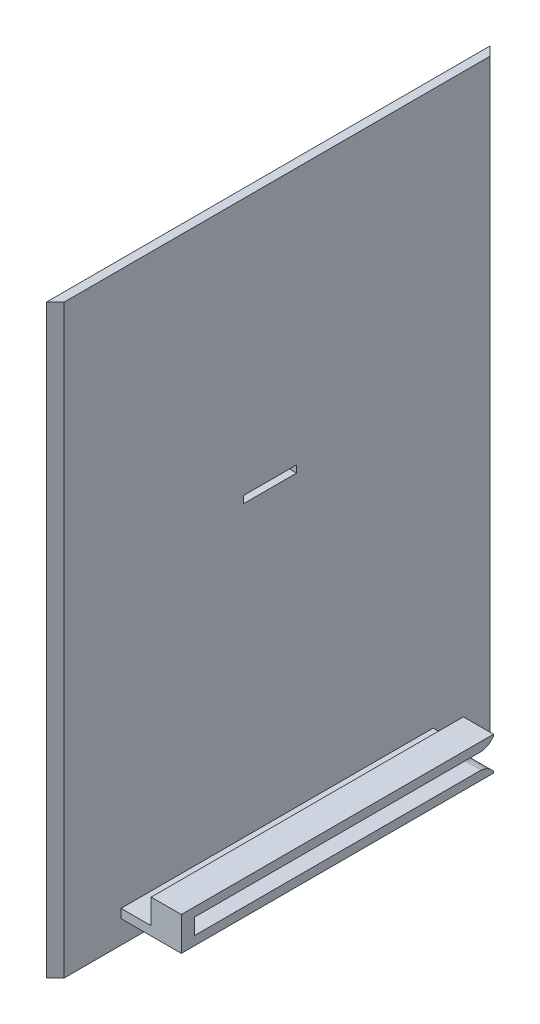
ISO-10303-21;
HEADER;
FILE_DESCRIPTION(('STEP AP214'),'2;1');
FILE_NAME('part.step','',(''),(''),'','','');
FILE_SCHEMA(('AUTOMOTIVE_DESIGN { 1 0 10303 214 1 1 1 1 }'));
ENDSEC;
DATA;
#1=APPLICATION_CONTEXT('core data for automotive mechanical design processes');
#2=APPLICATION_PROTOCOL_DEFINITION('international standard','automotive_design',2000,#1);
#3=PRODUCT_CONTEXT('',#1,'mechanical');
#4=PRODUCT('Part','Part','',(#3));
#5=PRODUCT_RELATED_PRODUCT_CATEGORY('part','',(#4));
#6=PRODUCT_DEFINITION_FORMATION('','',#4);
#7=PRODUCT_DEFINITION_CONTEXT('part definition',#1,'design');
#8=PRODUCT_DEFINITION('design','',#6,#7);
#9=PRODUCT_DEFINITION_SHAPE('','',#8);
#10=(LENGTH_UNIT() NAMED_UNIT(*) SI_UNIT(.MILLI.,.METRE.));
#11=(NAMED_UNIT(*) PLANE_ANGLE_UNIT() SI_UNIT($,.RADIAN.));
#12=(NAMED_UNIT(*) SI_UNIT($,.STERADIAN.) SOLID_ANGLE_UNIT());
#13=UNCERTAINTY_MEASURE_WITH_UNIT(LENGTH_MEASURE(1.E-05),#10,'distance_accuracy_value','');
#14=(GEOMETRIC_REPRESENTATION_CONTEXT(3) GLOBAL_UNCERTAINTY_ASSIGNED_CONTEXT((#13)) GLOBAL_UNIT_ASSIGNED_CONTEXT((#10,
#11,#12)) REPRESENTATION_CONTEXT('',''));
#15=CARTESIAN_POINT('',(0.,0.,0.));
#16=DIRECTION('',(0.,0.,1.));
#17=DIRECTION('',(1.,0.,0.));
#18=AXIS2_PLACEMENT_3D('',#15,#16,#17);
#19=CARTESIAN_POINT('',(34.,18.,-213.));
#20=DIRECTION('',(0.,-1.,0.));
#21=DIRECTION('',(0.,0.,-1.));
#22=AXIS2_PLACEMENT_3D('',#19,#20,#21);
#23=PLANE('',#22);
#24=DIRECTION('',(-1.,0.,0.));
#25=VECTOR('',#24,1.);
#26=CARTESIAN_POINT('',(34.,18.,-44.3341737770732));
#27=LINE('',#26,#25);
#28=CARTESIAN_POINT('',(34.,18.,-44.3341737770732));
#29=VERTEX_POINT('',#28);
#30=CARTESIAN_POINT('',(22.,18.,-44.3341737770732));
#31=VERTEX_POINT('',#30);
#32=EDGE_CURVE('E215',#29,#31,#27,.T.);
#33=ORIENTED_EDGE('',*,*,#32,.F.);
#34=DIRECTION('',(0.,0.,1.));
#35=VECTOR('',#34,1.);
#36=CARTESIAN_POINT('',(34.,18.,-213.));
#37=LINE('',#36,#35);
#38=CARTESIAN_POINT('',(34.,18.,-206.100505063388));
#39=VERTEX_POINT('',#38);
#40=EDGE_CURVE('E295',#39,#29,#37,.T.);
#41=ORIENTED_EDGE('',*,*,#40,.F.);
#42=CARTESIAN_POINT('',(19.2472348417211,18.,-206.100505063388));
#43=CARTESIAN_POINT('',(24.3989941033424,18.,-206.100505063388));
#44=CARTESIAN_POINT('',(29.5507533649635,18.,-206.100505063388));
#45=CARTESIAN_POINT('',(34.7025126265847,18.,-206.100505063388));
#46=(BOUNDED_CURVE() B_SPLINE_CURVE(3,(#42,#43,#44,#45),.UNSPECIFIED.,.F.,
.F.) B_SPLINE_CURVE_WITH_KNOTS((4,4),(-0.000702512626584708,0.0147527651582789),
.UNSPECIFIED.) CURVE() GEOMETRIC_REPRESENTATION_ITEM() RATIONAL_B_SPLINE_CURVE((1.,1.,1.,1.)) REPRESENTATION_ITEM(''));
#47=CARTESIAN_POINT('',(22.,18.,-206.100505063388));
#48=VERTEX_POINT('',#47);
#49=EDGE_CURVE('E314',#39,#48,#46,.F.);
#50=ORIENTED_EDGE('',*,*,#49,.T.);
#51=DIRECTION('',(0.,0.,-1.));
#52=VECTOR('',#51,1.);
#53=CARTESIAN_POINT('',(22.,18.,-213.));
#54=LINE('',#53,#52);
#55=EDGE_CURVE('E275',#31,#48,#54,.T.);
#56=ORIENTED_EDGE('',*,*,#55,.F.);
#57=EDGE_LOOP('',(#33,#41,#50,#56));
#58=FACE_BOUND('',#57,.T.);
#59=ADVANCED_FACE('F46',(#58),#23,.F.);
#60=CARTESIAN_POINT('',(22.,27.,-213.));
#61=DIRECTION('',(-1.,0.,0.));
#62=DIRECTION('',(0.,0.,1.));
#63=AXIS2_PLACEMENT_3D('',#60,#61,#62);
#64=PLANE('',#63);
#65=DIRECTION('',(0.,-1.,0.));
#66=VECTOR('',#65,1.);
#67=CARTESIAN_POINT('',(22.,27.,-44.3341737770732));
#68=LINE('',#67,#66);
#69=CARTESIAN_POINT('',(22.,27.,-44.3341737770732));
#70=VERTEX_POINT('',#69);
#71=EDGE_CURVE('E241',#70,#31,#68,.T.);
#72=ORIENTED_EDGE('',*,*,#71,.T.);
#73=ORIENTED_EDGE('',*,*,#55,.T.);
#74=CARTESIAN_POINT('',(22.,29.7052777848636,-206.100505063388));
#75=CARTESIAN_POINT('',(22.,24.9017592616212,-206.100505063388));
#76=CARTESIAN_POINT('',(22.,20.0982407383788,-206.100505063388));
#77=CARTESIAN_POINT('',(22.,15.2947222151364,-206.100505063388));
#78=(BOUNDED_CURVE() B_SPLINE_CURVE(3,(#74,#75,#76,#77),.UNSPECIFIED.,.F.,
.F.) B_SPLINE_CURVE_WITH_KNOTS((4,4),(-0.0117052777848636,0.00270527778486358),
.UNSPECIFIED.) CURVE() GEOMETRIC_REPRESENTATION_ITEM() RATIONAL_B_SPLINE_CURVE((1.,1.,1.,1.)) REPRESENTATION_ITEM(''));
#79=CARTESIAN_POINT('',(22.,27.,-206.100505063388));
#80=VERTEX_POINT('',#79);
#81=EDGE_CURVE('E483',#48,#80,#78,.F.);
#82=ORIENTED_EDGE('',*,*,#81,.T.);
#83=DIRECTION('',(0.,0.,-1.));
#84=VECTOR('',#83,1.);
#85=CARTESIAN_POINT('',(22.,27.,-213.));
#86=LINE('',#85,#84);
#87=EDGE_CURVE('E271',#70,#80,#86,.T.);
#88=ORIENTED_EDGE('',*,*,#87,.F.);
#89=EDGE_LOOP('',(#72,#73,#82,#88));
#90=FACE_BOUND('',#89,.T.);
#91=ADVANCED_FACE('F331',(#90),#64,.F.);
#92=CARTESIAN_POINT('',(0.,27.,0.));
#93=DIRECTION('',(0.,1.,0.));
#94=DIRECTION('',(0.,0.,1.));
#95=AXIS2_PLACEMENT_3D('',#92,#93,#94);
#96=PLANE('',#95);
#97=DIRECTION('',(-1.,0.,0.));
#98=VECTOR('',#97,1.);
#99=CARTESIAN_POINT('',(34.,27.,-44.3341737770732));
#100=LINE('',#99,#98);
#101=CARTESIAN_POINT('',(34.,27.,-44.3341737770732));
#102=VERTEX_POINT('',#101);
#103=EDGE_CURVE('E238',#102,#70,#100,.T.);
#104=ORIENTED_EDGE('',*,*,#103,.T.);
#105=ORIENTED_EDGE('',*,*,#87,.T.);
#106=CARTESIAN_POINT('',(34.7025126265847,27.,-206.100505063388));
#107=CARTESIAN_POINT('',(29.5507533649635,27.,-206.100505063388));
#108=CARTESIAN_POINT('',(24.3989941033423,27.,-206.100505063388));
#109=CARTESIAN_POINT('',(19.2472348417211,27.,-206.100505063388));
#110=(BOUNDED_CURVE() B_SPLINE_CURVE(3,(#106,#107,#108,#109),.UNSPECIFIED.,.F.,
.F.) B_SPLINE_CURVE_WITH_KNOTS((4,4),(0.0192472348417211,0.0347025126265847),
.UNSPECIFIED.) CURVE() GEOMETRIC_REPRESENTATION_ITEM() RATIONAL_B_SPLINE_CURVE((1.,1.,1.,1.)) REPRESENTATION_ITEM(''));
#111=CARTESIAN_POINT('',(34.,27.,-206.100505063388));
#112=VERTEX_POINT('',#111);
#113=EDGE_CURVE('E552',#80,#112,#110,.F.);
#114=ORIENTED_EDGE('',*,*,#113,.T.);
#115=DIRECTION('',(0.,0.,-1.));
#116=VECTOR('',#115,1.);
#117=CARTESIAN_POINT('',(34.,27.,-213.));
#118=LINE('',#117,#116);
#119=EDGE_CURVE('E252',#102,#112,#118,.T.);
#120=ORIENTED_EDGE('',*,*,#119,.F.);
#121=EDGE_LOOP('',(#104,#105,#114,#120));
#122=FACE_BOUND('',#121,.T.);
#123=ADVANCED_FACE('F588',(#122),#96,.F.);
#124=DIRECTION('',(0.,0.,1.));
#125=VECTOR('',#124,1.);
#126=CARTESIAN_POINT('',(17.,18.,-213.));
#127=LINE('',#126,#125);
#128=CARTESIAN_POINT('',(17.,18.,-213.));
#129=VERTEX_POINT('',#128);
#130=CARTESIAN_POINT('',(17.,18.,-37.));
#131=VERTEX_POINT('',#130);
#132=EDGE_CURVE('E274',#129,#131,#127,.T.);
#133=ORIENTED_EDGE('',*,*,#132,.F.);
#134=DIRECTION('',(-1.,0.,0.));
#135=VECTOR('',#134,1.);
#136=CARTESIAN_POINT('',(34.,18.,-213.));
#137=LINE('',#136,#135);
#138=CARTESIAN_POINT('',(0.,18.,-213.));
#139=VERTEX_POINT('',#138);
#140=EDGE_CURVE('E666',#129,#139,#137,.T.);
#141=ORIENTED_EDGE('',*,*,#140,.T.);
#142=DIRECTION('',(0.,0.,1.));
#143=VECTOR('',#142,1.);
#144=CARTESIAN_POINT('',(0.,18.,-213.));
#145=LINE('',#144,#143);
#146=CARTESIAN_POINT('',(0.,18.,-37.));
#147=VERTEX_POINT('',#146);
#148=EDGE_CURVE('E290',#139,#147,#145,.T.);
#149=ORIENTED_EDGE('',*,*,#148,.T.);
#150=DIRECTION('',(-1.,0.,0.));
#151=VECTOR('',#150,1.);
#152=CARTESIAN_POINT('',(34.,18.,-37.));
#153=LINE('',#152,#151);
#154=EDGE_CURVE('E303',#131,#147,#153,.T.);
#155=ORIENTED_EDGE('',*,*,#154,.F.);
#156=EDGE_LOOP('',(#133,#141,#149,#155));
#157=FACE_BOUND('',#156,.T.);
#158=ADVANCED_FACE('F332',(#157),#23,.F.);
#159=CARTESIAN_POINT('',(0.,330.,0.));
#160=DIRECTION('',(-1.,0.,0.));
#161=DIRECTION('',(0.,0.,1.));
#162=AXIS2_PLACEMENT_3D('',#159,#160,#161);
#163=PLANE('',#162);
#164=DIRECTION('',(0.,0.,1.));
#165=VECTOR('',#164,1.);
#166=CARTESIAN_POINT('',(0.,185.,-136.));
#167=LINE('',#166,#165);
#168=CARTESIAN_POINT('',(0.,185.,-136.));
#169=VERTEX_POINT('',#168);
#170=CARTESIAN_POINT('',(0.,185.,-106.));
#171=VERTEX_POINT('',#170);
#172=EDGE_CURVE('E221',#169,#171,#167,.T.);
#173=ORIENTED_EDGE('',*,*,#172,.F.);
#174=DIRECTION('',(0.,1.,0.));
#175=VECTOR('',#174,1.);
#176=CARTESIAN_POINT('',(0.,185.,-136.));
#177=LINE('',#176,#175);
#178=CARTESIAN_POINT('',(0.,181.,-136.));
#179=VERTEX_POINT('',#178);
#180=EDGE_CURVE('E203',#179,#169,#177,.T.);
#181=ORIENTED_EDGE('',*,*,#180,.F.);
#182=DIRECTION('',(0.,0.,-1.));
#183=VECTOR('',#182,1.);
#184=CARTESIAN_POINT('',(0.,181.,-136.));
#185=LINE('',#184,#183);
#186=CARTESIAN_POINT('',(0.,181.,-106.));
#187=VERTEX_POINT('',#186);
#188=EDGE_CURVE('E212',#187,#179,#185,.T.);
#189=ORIENTED_EDGE('',*,*,#188,.F.);
#190=DIRECTION('',(0.,-1.,0.));
#191=VECTOR('',#190,1.);
#192=CARTESIAN_POINT('',(0.,185.,-106.));
#193=LINE('',#192,#191);
#194=EDGE_CURVE('E68',#171,#187,#193,.T.);
#195=ORIENTED_EDGE('',*,*,#194,.F.);
#196=EDGE_LOOP('',(#173,#181,#189,#195));
#197=FACE_BOUND('',#196,.T.);
#198=DIRECTION('',(0.,0.,-1.));
#199=VECTOR('',#198,1.);
#200=CARTESIAN_POINT('',(0.,0.,0.));
#201=LINE('',#200,#199);
#202=CARTESIAN_POINT('',(0.,0.,-5.));
#203=VERTEX_POINT('',#202);
#204=CARTESIAN_POINT('',(0.,0.,-245.));
#205=VERTEX_POINT('',#204);
#206=EDGE_CURVE('E628',#203,#205,#201,.T.);
#207=ORIENTED_EDGE('',*,*,#206,.T.);
#208=DIRECTION('',(0.,1.,0.));
#209=VECTOR('',#208,1.);
#210=CARTESIAN_POINT('',(0.,-0.000999999999973245,-245.));
#211=LINE('',#210,#209);
#212=CARTESIAN_POINT('',(0.,330.,-245.));
#213=VERTEX_POINT('',#212);
#214=EDGE_CURVE('E672',#205,#213,#211,.T.);
#215=ORIENTED_EDGE('',*,*,#214,.T.);
#216=DIRECTION('',(0.,0.,-1.));
#217=VECTOR('',#216,1.);
#218=CARTESIAN_POINT('',(0.,330.,0.));
#219=LINE('',#218,#217);
#220=CARTESIAN_POINT('',(0.,330.,-5.));
#221=VERTEX_POINT('',#220);
#222=EDGE_CURVE('E627',#221,#213,#219,.T.);
#223=ORIENTED_EDGE('',*,*,#222,.F.);
#224=DIRECTION('',(0.,1.,0.));
#225=VECTOR('',#224,1.);
#226=CARTESIAN_POINT('',(0.,-0.000999999999973245,-5.));
#227=LINE('',#226,#225);
#228=EDGE_CURVE('E673',#203,#221,#227,.T.);
#229=ORIENTED_EDGE('',*,*,#228,.F.);
#230=EDGE_LOOP('',(#207,#215,#223,#229));
#231=FACE_BOUND('',#230,.T.);
#232=DIRECTION('',(0.,-1.,0.));
#233=VECTOR('',#232,1.);
#234=CARTESIAN_POINT('',(0.,18.,-37.));
#235=LINE('',#234,#233);
#236=CARTESIAN_POINT('',(0.,13.,-37.));
#237=VERTEX_POINT('',#236);
#238=EDGE_CURVE('E285',#147,#237,#235,.T.);
#239=ORIENTED_EDGE('',*,*,#238,.F.);
#240=ORIENTED_EDGE('',*,*,#148,.F.);
#241=DIRECTION('',(0.,1.,0.));
#242=VECTOR('',#241,1.);
#243=CARTESIAN_POINT('',(0.,13.,-213.));
#244=LINE('',#243,#242);
#245=CARTESIAN_POINT('',(0.,13.,-213.));
#246=VERTEX_POINT('',#245);
#247=EDGE_CURVE('E693',#246,#139,#244,.T.);
#248=ORIENTED_EDGE('',*,*,#247,.F.);
#249=DIRECTION('',(0.,0.,-1.));
#250=VECTOR('',#249,1.);
#251=CARTESIAN_POINT('',(0.,13.,-37.));
#252=LINE('',#251,#250);
#253=EDGE_CURVE('E688',#237,#246,#252,.T.);
#254=ORIENTED_EDGE('',*,*,#253,.F.);
#255=EDGE_LOOP('',(#239,#240,#248,#254));
#256=FACE_BOUND('',#255,.T.);
#257=ADVANCED_FACE('F218',(#197,#231,#256),#163,.F.);
#258=CARTESIAN_POINT('',(-5.,330.,-250.));
#259=DIRECTION('',(1.,0.,0.));
#260=DIRECTION('',(0.,0.,-1.));
#261=AXIS2_PLACEMENT_3D('',#258,#259,#260);
#262=PLANE('',#261);
#263=DIRECTION('',(0.,0.,1.));
#264=VECTOR('',#263,1.);
#265=CARTESIAN_POINT('',(-4.99999999999999,181.,-136.));
#266=LINE('',#265,#264);
#267=CARTESIAN_POINT('',(-4.99999999999999,181.,-136.));
#268=VERTEX_POINT('',#267);
#269=CARTESIAN_POINT('',(-4.99999999999998,181.,-106.));
#270=VERTEX_POINT('',#269);
#271=EDGE_CURVE('E223',#268,#270,#266,.T.);
#272=ORIENTED_EDGE('',*,*,#271,.F.);
#273=DIRECTION('',(0.,-1.,0.));
#274=VECTOR('',#273,1.);
#275=CARTESIAN_POINT('',(-4.99999999999999,185.,-136.));
#276=LINE('',#275,#274);
#277=CARTESIAN_POINT('',(-4.99999999999999,185.,-136.));
#278=VERTEX_POINT('',#277);
#279=EDGE_CURVE('E76',#278,#268,#276,.T.);
#280=ORIENTED_EDGE('',*,*,#279,.F.);
#281=DIRECTION('',(0.,0.,-1.));
#282=VECTOR('',#281,1.);
#283=CARTESIAN_POINT('',(-4.99999999999999,185.,-136.));
#284=LINE('',#283,#282);
#285=CARTESIAN_POINT('',(-4.99999999999998,185.,-106.));
#286=VERTEX_POINT('',#285);
#287=EDGE_CURVE('E209',#286,#278,#284,.T.);
#288=ORIENTED_EDGE('',*,*,#287,.F.);
#289=DIRECTION('',(0.,1.,0.));
#290=VECTOR('',#289,1.);
#291=CARTESIAN_POINT('',(-4.99999999999998,185.,-106.));
#292=LINE('',#291,#290);
#293=EDGE_CURVE('E229',#270,#286,#292,.T.);
#294=ORIENTED_EDGE('',*,*,#293,.F.);
#295=EDGE_LOOP('',(#272,#280,#288,#294));
#296=FACE_BOUND('',#295,.T.);
#297=DIRECTION('',(0.,0.,1.));
#298=VECTOR('',#297,1.);
#299=CARTESIAN_POINT('',(-5.,0.,-250.));
#300=LINE('',#299,#298);
#301=CARTESIAN_POINT('',(-5.,0.,-250.));
#302=VERTEX_POINT('',#301);
#303=CARTESIAN_POINT('',(-4.99999999999997,0.,0.));
#304=VERTEX_POINT('',#303);
#305=EDGE_CURVE('E621',#302,#304,#300,.T.);
#306=ORIENTED_EDGE('',*,*,#305,.T.);
#307=DIRECTION('',(0.,-1.,0.));
#308=VECTOR('',#307,1.);
#309=CARTESIAN_POINT('',(-4.99999999999997,330.,0.));
#310=LINE('',#309,#308);
#311=CARTESIAN_POINT('',(-4.99999999999997,330.,0.));
#312=VERTEX_POINT('',#311);
#313=EDGE_CURVE('E623',#312,#304,#310,.T.);
#314=ORIENTED_EDGE('',*,*,#313,.F.);
#315=DIRECTION('',(0.,0.,1.));
#316=VECTOR('',#315,1.);
#317=CARTESIAN_POINT('',(-5.,330.,-250.));
#318=LINE('',#317,#316);
#319=CARTESIAN_POINT('',(-5.,330.,-250.));
#320=VERTEX_POINT('',#319);
#321=EDGE_CURVE('E631',#320,#312,#318,.T.);
#322=ORIENTED_EDGE('',*,*,#321,.F.);
#323=DIRECTION('',(0.,-1.,0.));
#324=VECTOR('',#323,1.);
#325=CARTESIAN_POINT('',(-5.,330.,-250.));
#326=LINE('',#325,#324);
#327=EDGE_CURVE('E624',#320,#302,#326,.T.);
#328=ORIENTED_EDGE('',*,*,#327,.T.);
#329=EDGE_LOOP('',(#306,#314,#322,#328));
#330=FACE_BOUND('',#329,.T.);
#331=ADVANCED_FACE('F360',(#296,#330),#262,.F.);
#332=CARTESIAN_POINT('',(0.,330.,0.));
#333=DIRECTION('',(0.,1.,0.));
#334=DIRECTION('',(0.,0.,1.));
#335=AXIS2_PLACEMENT_3D('',#332,#333,#334);
#336=PLANE('',#335);
#337=DIRECTION('',(0.707106781186547,0.,0.707106781186548));
#338=VECTOR('',#337,1.);
#339=CARTESIAN_POINT('',(0.,330.,-245.));
#340=LINE('',#339,#338);
#341=EDGE_CURVE('E670',#320,#213,#340,.T.);
#342=ORIENTED_EDGE('',*,*,#341,.F.);
#343=ORIENTED_EDGE('',*,*,#321,.T.);
#344=DIRECTION('',(-0.707106781186545,0.,0.70710678118655));
#345=VECTOR('',#344,1.);
#346=CARTESIAN_POINT('',(-4.99999999999997,330.,0.));
#347=LINE('',#346,#345);
#348=EDGE_CURVE('E664',#221,#312,#347,.T.);
#349=ORIENTED_EDGE('',*,*,#348,.F.);
#350=ORIENTED_EDGE('',*,*,#222,.T.);
#351=EDGE_LOOP('',(#342,#343,#349,#350));
#352=FACE_BOUND('',#351,.T.);
#353=ADVANCED_FACE('F357',(#352),#336,.T.);
#354=CARTESIAN_POINT('',(0.,0.,0.));
#355=DIRECTION('',(0.,1.,0.));
#356=DIRECTION('',(0.,0.,1.));
#357=AXIS2_PLACEMENT_3D('',#354,#355,#356);
#358=PLANE('',#357);
#359=ORIENTED_EDGE('',*,*,#305,.F.);
#360=DIRECTION('',(-0.707106781186547,0.,-0.707106781186548));
#361=VECTOR('',#360,1.);
#362=CARTESIAN_POINT('',(0.,0.,-245.));
#363=LINE('',#362,#361);
#364=EDGE_CURVE('E634',#205,#302,#363,.T.);
#365=ORIENTED_EDGE('',*,*,#364,.F.);
#366=ORIENTED_EDGE('',*,*,#206,.F.);
#367=DIRECTION('',(0.707106781186545,0.,-0.70710678118655));
#368=VECTOR('',#367,1.);
#369=CARTESIAN_POINT('',(-4.99999999999997,0.,0.));
#370=LINE('',#369,#368);
#371=EDGE_CURVE('E661',#304,#203,#370,.T.);
#372=ORIENTED_EDGE('',*,*,#371,.F.);
#373=EDGE_LOOP('',(#359,#365,#366,#372));
#374=FACE_BOUND('',#373,.T.);
#375=ADVANCED_FACE('F355',(#374),#358,.F.);
#376=CARTESIAN_POINT('',(-4.99999999999997,-0.000999999999973245,0.));
#377=DIRECTION('',(-0.70710678118655,0.,-0.707106781186545));
#378=DIRECTION('',(-0.707106781186545,0.,0.70710678118655));
#379=AXIS2_PLACEMENT_3D('',#376,#377,#378);
#380=PLANE('',#379);
#381=ORIENTED_EDGE('',*,*,#371,.T.);
#382=ORIENTED_EDGE('',*,*,#228,.T.);
#383=ORIENTED_EDGE('',*,*,#348,.T.);
#384=ORIENTED_EDGE('',*,*,#313,.T.);
#385=EDGE_LOOP('',(#381,#382,#383,#384));
#386=FACE_BOUND('',#385,.T.);
#387=ADVANCED_FACE('F351',(#386),#380,.F.);
#388=CARTESIAN_POINT('',(0.,-0.000999999999973245,-245.));
#389=DIRECTION('',(-0.707106781186548,0.,0.707106781186547));
#390=DIRECTION('',(0.707106781186547,0.,0.707106781186548));
#391=AXIS2_PLACEMENT_3D('',#388,#389,#390);
#392=PLANE('',#391);
#393=ORIENTED_EDGE('',*,*,#364,.T.);
#394=ORIENTED_EDGE('',*,*,#327,.F.);
#395=ORIENTED_EDGE('',*,*,#341,.T.);
#396=ORIENTED_EDGE('',*,*,#214,.F.);
#397=EDGE_LOOP('',(#393,#394,#395,#396));
#398=FACE_BOUND('',#397,.T.);
#399=ADVANCED_FACE('F347',(#398),#392,.F.);
#400=CARTESIAN_POINT('',(34.,18.,-37.));
#401=DIRECTION('',(0.,0.,-1.));
#402=DIRECTION('',(0.,1.,0.));
#403=AXIS2_PLACEMENT_3D('',#400,#401,#402);
#404=PLANE('',#403);
#405=DIRECTION('',(0.,-1.,0.));
#406=VECTOR('',#405,1.);
#407=CARTESIAN_POINT('',(34.,18.,-37.));
#408=LINE('',#407,#406);
#409=CARTESIAN_POINT('',(34.,32.,-37.));
#410=VERTEX_POINT('',#409);
#411=CARTESIAN_POINT('',(34.,13.,-37.));
#412=VERTEX_POINT('',#411);
#413=EDGE_CURVE('E286',#410,#412,#408,.T.);
#414=ORIENTED_EDGE('',*,*,#413,.F.);
#415=DIRECTION('',(1.,0.,0.));
#416=VECTOR('',#415,1.);
#417=CARTESIAN_POINT('',(17.,32.,-37.));
#418=LINE('',#417,#416);
#419=CARTESIAN_POINT('',(17.,32.,-37.));
#420=VERTEX_POINT('',#419);
#421=EDGE_CURVE('E251',#420,#410,#418,.T.);
#422=ORIENTED_EDGE('',*,*,#421,.F.);
#423=DIRECTION('',(0.,-1.,0.));
#424=VECTOR('',#423,1.);
#425=CARTESIAN_POINT('',(17.,27.,-37.));
#426=LINE('',#425,#424);
#427=EDGE_CURVE('E273',#420,#131,#426,.T.);
#428=ORIENTED_EDGE('',*,*,#427,.T.);
#429=ORIENTED_EDGE('',*,*,#154,.T.);
#430=ORIENTED_EDGE('',*,*,#238,.T.);
#431=DIRECTION('',(-1.,0.,0.));
#432=VECTOR('',#431,1.);
#433=CARTESIAN_POINT('',(34.,13.,-37.));
#434=LINE('',#433,#432);
#435=EDGE_CURVE('E658',#412,#237,#434,.T.);
#436=ORIENTED_EDGE('',*,*,#435,.F.);
#437=EDGE_LOOP('',(#414,#422,#428,#429,#430,#436));
#438=FACE_BOUND('',#437,.T.);
#439=ADVANCED_FACE('F343',(#438),#404,.F.);
#440=CARTESIAN_POINT('',(34.,13.,-37.));
#441=DIRECTION('',(0.,1.,0.));
#442=DIRECTION('',(0.,0.,1.));
#443=AXIS2_PLACEMENT_3D('',#440,#441,#442);
#444=PLANE('',#443);
#445=ORIENTED_EDGE('',*,*,#253,.T.);
#446=DIRECTION('',(-1.,0.,0.));
#447=VECTOR('',#446,1.);
#448=CARTESIAN_POINT('',(34.,13.,-213.));
#449=LINE('',#448,#447);
#450=CARTESIAN_POINT('',(34.,13.,-213.));
#451=VERTEX_POINT('',#450);
#452=EDGE_CURVE('E662',#451,#246,#449,.T.);
#453=ORIENTED_EDGE('',*,*,#452,.F.);
#454=DIRECTION('',(0.,0.,-1.));
#455=VECTOR('',#454,1.);
#456=CARTESIAN_POINT('',(34.,13.,-37.));
#457=LINE('',#456,#455);
#458=EDGE_CURVE('E289',#412,#451,#457,.T.);
#459=ORIENTED_EDGE('',*,*,#458,.F.);
#460=ORIENTED_EDGE('',*,*,#435,.T.);
#461=EDGE_LOOP('',(#445,#453,#459,#460));
#462=FACE_BOUND('',#461,.T.);
#463=ADVANCED_FACE('F339',(#462),#444,.F.);
#464=CARTESIAN_POINT('',(34.,13.,-213.));
#465=DIRECTION('',(0.,0.,1.));
#466=DIRECTION('',(1.,0.,0.));
#467=AXIS2_PLACEMENT_3D('',#464,#465,#466);
#468=PLANE('',#467);
#469=DIRECTION('',(0.,-1.,0.));
#470=VECTOR('',#469,1.);
#471=CARTESIAN_POINT('',(18.,13.,-213.));
#472=LINE('',#471,#470);
#473=CARTESIAN_POINT('',(18.,31.,-213.));
#474=VERTEX_POINT('',#473);
#475=CARTESIAN_POINT('',(18.,14.,-213.));
#476=VERTEX_POINT('',#475);
#477=EDGE_CURVE('E640',#474,#476,#472,.T.);
#478=ORIENTED_EDGE('',*,*,#477,.T.);
#479=DIRECTION('',(1.,0.,0.));
#480=VECTOR('',#479,1.);
#481=CARTESIAN_POINT('',(34.,14.,-213.));
#482=LINE('',#481,#480);
#483=CARTESIAN_POINT('',(34.,14.,-213.));
#484=VERTEX_POINT('',#483);
#485=EDGE_CURVE('E560',#476,#484,#482,.T.);
#486=ORIENTED_EDGE('',*,*,#485,.T.);
#487=DIRECTION('',(0.,1.,0.));
#488=VECTOR('',#487,1.);
#489=CARTESIAN_POINT('',(34.,13.,-213.));
#490=LINE('',#489,#488);
#491=EDGE_CURVE('E292',#451,#484,#490,.T.);
#492=ORIENTED_EDGE('',*,*,#491,.F.);
#493=ORIENTED_EDGE('',*,*,#452,.T.);
#494=ORIENTED_EDGE('',*,*,#247,.T.);
#495=ORIENTED_EDGE('',*,*,#140,.F.);
#496=DIRECTION('',(0.,-1.,0.));
#497=VECTOR('',#496,1.);
#498=CARTESIAN_POINT('',(17.,27.,-213.));
#499=LINE('',#498,#497);
#500=CARTESIAN_POINT('',(17.,32.,-213.));
#501=VERTEX_POINT('',#500);
#502=EDGE_CURVE('E283',#501,#129,#499,.T.);
#503=ORIENTED_EDGE('',*,*,#502,.F.);
#504=DIRECTION('',(-1.,0.,0.));
#505=VECTOR('',#504,1.);
#506=CARTESIAN_POINT('',(17.,32.,-213.));
#507=LINE('',#506,#505);
#508=CARTESIAN_POINT('',(34.,32.,-213.));
#509=VERTEX_POINT('',#508);
#510=EDGE_CURVE('E257',#509,#501,#507,.T.);
#511=ORIENTED_EDGE('',*,*,#510,.F.);
#512=DIRECTION('',(0.,-1.,0.));
#513=VECTOR('',#512,1.);
#514=CARTESIAN_POINT('',(34.,32.,-213.));
#515=LINE('',#514,#513);
#516=CARTESIAN_POINT('',(34.,31.,-213.));
#517=VERTEX_POINT('',#516);
#518=EDGE_CURVE('E260',#509,#517,#515,.T.);
#519=ORIENTED_EDGE('',*,*,#518,.T.);
#520=DIRECTION('',(-1.,0.,0.));
#521=VECTOR('',#520,1.);
#522=CARTESIAN_POINT('',(34.,31.,-213.));
#523=LINE('',#522,#521);
#524=EDGE_CURVE('E642',#517,#474,#523,.T.);
#525=ORIENTED_EDGE('',*,*,#524,.T.);
#526=EDGE_LOOP('',(#478,#486,#492,#493,#494,#495,#503,#511,#519,#525));
#527=FACE_BOUND('',#526,.T.);
#528=ADVANCED_FACE('F336',(#527),#468,.F.);
#529=CARTESIAN_POINT('',(34.,0.,0.));
#530=DIRECTION('',(1.,0.,0.));
#531=DIRECTION('',(0.,0.,-1.));
#532=AXIS2_PLACEMENT_3D('',#529,#530,#531);
#533=PLANE('',#532);
#534=DIRECTION('',(0.,-0.707106781186547,-0.707106781186548));
#535=VECTOR('',#534,1.);
#536=CARTESIAN_POINT('',(34.,113.5,-113.5));
#537=LINE('',#536,#535);
#538=CARTESIAN_POINT('',(34.,15.9497474683058,-211.050252531694));
#539=VERTEX_POINT('',#538);
#540=EDGE_CURVE('E320',#484,#539,#537,.F.);
#541=ORIENTED_EDGE('',*,*,#540,.T.);
#542=CARTESIAN_POINT('',(34.,18.,-206.100505063388));
#543=CARTESIAN_POINT('',(34.,18.,-209.));
#544=CARTESIAN_POINT('',(34.,15.9497474683058,-211.050252531694));
#545=(BOUNDED_CURVE() B_SPLINE_CURVE(2,(#542,#543,#544),.UNSPECIFIED.,.F.,
.F.) B_SPLINE_CURVE_WITH_KNOTS((3,3),(0.,1.),
.UNSPECIFIED.) CURVE() GEOMETRIC_REPRESENTATION_ITEM() RATIONAL_B_SPLINE_CURVE((1.,
0.428571428571429,1.)) REPRESENTATION_ITEM(''));
#546=EDGE_CURVE('E13',#539,#39,#545,.F.);
#547=ORIENTED_EDGE('',*,*,#546,.T.);
#548=ORIENTED_EDGE('',*,*,#40,.T.);
#549=DIRECTION('',(0.,-1.,0.));
#550=VECTOR('',#549,1.);
#551=CARTESIAN_POINT('',(34.,27.,-44.3341737770732));
#552=LINE('',#551,#550);
#553=EDGE_CURVE('E245',#102,#29,#552,.T.);
#554=ORIENTED_EDGE('',*,*,#553,.F.);
#555=ORIENTED_EDGE('',*,*,#119,.T.);
#556=CARTESIAN_POINT('',(34.,29.0502525316942,-211.050252531694));
#557=CARTESIAN_POINT('',(34.,27.,-209.));
#558=CARTESIAN_POINT('',(34.,27.,-206.100505063388));
#559=(BOUNDED_CURVE() B_SPLINE_CURVE(2,(#556,#557,#558),.UNSPECIFIED.,.F.,
.F.) B_SPLINE_CURVE_WITH_KNOTS((3,3),(0.,1.),
.UNSPECIFIED.) CURVE() GEOMETRIC_REPRESENTATION_ITEM() RATIONAL_B_SPLINE_CURVE((1.,
0.428571428571429,1.)) REPRESENTATION_ITEM(''));
#560=CARTESIAN_POINT('',(34.,29.0502525316942,-211.050252531694));
#561=VERTEX_POINT('',#560);
#562=EDGE_CURVE('E407',#112,#561,#559,.F.);
#563=ORIENTED_EDGE('',*,*,#562,.T.);
#564=DIRECTION('',(0.,-0.707106781186547,0.707106781186548));
#565=VECTOR('',#564,1.);
#566=CARTESIAN_POINT('',(34.,31.,-213.));
#567=LINE('',#566,#565);
#568=EDGE_CURVE('E553',#561,#517,#567,.F.);
#569=ORIENTED_EDGE('',*,*,#568,.T.);
#570=ORIENTED_EDGE('',*,*,#518,.F.);
#571=DIRECTION('',(0.,0.,-1.));
#572=VECTOR('',#571,1.);
#573=CARTESIAN_POINT('',(34.,32.,-213.));
#574=LINE('',#573,#572);
#575=EDGE_CURVE('E255',#410,#509,#574,.T.);
#576=ORIENTED_EDGE('',*,*,#575,.F.);
#577=ORIENTED_EDGE('',*,*,#413,.T.);
#578=ORIENTED_EDGE('',*,*,#458,.T.);
#579=ORIENTED_EDGE('',*,*,#491,.T.);
#580=EDGE_LOOP('',(#541,#547,#548,#554,#555,#563,#569,#570,#576,#577,#578,#579));
#581=FACE_BOUND('',#580,.T.);
#582=ADVANCED_FACE('F333',(#581),#533,.T.);
#583=CARTESIAN_POINT('',(17.,27.,-213.));
#584=DIRECTION('',(1.,0.,0.));
#585=DIRECTION('',(0.,0.,-1.));
#586=AXIS2_PLACEMENT_3D('',#583,#584,#585);
#587=PLANE('',#586);
#588=ORIENTED_EDGE('',*,*,#132,.T.);
#589=ORIENTED_EDGE('',*,*,#427,.F.);
#590=DIRECTION('',(0.,0.,1.));
#591=VECTOR('',#590,1.);
#592=CARTESIAN_POINT('',(17.,32.,-213.));
#593=LINE('',#592,#591);
#594=EDGE_CURVE('E248',#501,#420,#593,.T.);
#595=ORIENTED_EDGE('',*,*,#594,.F.);
#596=ORIENTED_EDGE('',*,*,#502,.T.);
#597=EDGE_LOOP('',(#588,#589,#595,#596));
#598=FACE_BOUND('',#597,.T.);
#599=ADVANCED_FACE('F589',(#598),#587,.F.);
#600=CARTESIAN_POINT('',(0.,32.,0.));
#601=DIRECTION('',(0.,1.,0.));
#602=DIRECTION('',(0.,0.,1.));
#603=AXIS2_PLACEMENT_3D('',#600,#601,#602);
#604=PLANE('',#603);
#605=ORIENTED_EDGE('',*,*,#594,.T.);
#606=ORIENTED_EDGE('',*,*,#421,.T.);
#607=ORIENTED_EDGE('',*,*,#575,.T.);
#608=ORIENTED_EDGE('',*,*,#510,.T.);
#609=EDGE_LOOP('',(#605,#606,#607,#608));
#610=FACE_BOUND('',#609,.T.);
#611=ADVANCED_FACE('F591',(#610),#604,.T.);
#612=CARTESIAN_POINT('',(34.,31.,-213.));
#613=DIRECTION('',(0.,0.707106781186548,0.707106781186547));
#614=DIRECTION('',(-1.,0.,0.));
#615=AXIS2_PLACEMENT_3D('',#612,#613,#614);
#616=PLANE('',#615);
#617=ORIENTED_EDGE('',*,*,#568,.F.);
#618=CARTESIAN_POINT('',(19.2472348417211,29.0502525316942,-211.050252531694));
#619=CARTESIAN_POINT('',(24.3989941033423,29.0502525316942,-211.050252531694));
#620=CARTESIAN_POINT('',(29.5507533649635,29.0502525316942,-211.050252531694));
#621=CARTESIAN_POINT('',(34.7025126265847,29.0502525316942,-211.050252531694));
#622=(BOUNDED_CURVE() B_SPLINE_CURVE(3,(#618,#619,#620,#621),.UNSPECIFIED.,.F.,
.F.) B_SPLINE_CURVE_WITH_KNOTS((4,4),(0.0192472348417211,0.0347025126265847),
.UNSPECIFIED.) CURVE() GEOMETRIC_REPRESENTATION_ITEM() RATIONAL_B_SPLINE_CURVE((1.,1.,1.,1.)) REPRESENTATION_ITEM(''));
#623=CARTESIAN_POINT('',(19.9497474683058,29.0502525316942,-211.050252531694));
#624=VERTEX_POINT('',#623);
#625=EDGE_CURVE('E471',#561,#624,#622,.F.);
#626=ORIENTED_EDGE('',*,*,#625,.T.);
#627=DIRECTION('',(0.577350269189626,-0.577350269189626,0.577350269189626));
#628=VECTOR('',#627,1.);
#629=CARTESIAN_POINT('',(23.3333333333333,25.6666666666667,-207.666666666667));
#630=LINE('',#629,#628);
#631=EDGE_CURVE('E267',#474,#624,#630,.T.);
#632=ORIENTED_EDGE('',*,*,#631,.F.);
#633=ORIENTED_EDGE('',*,*,#524,.F.);
#634=EDGE_LOOP('',(#617,#626,#632,#633));
#635=FACE_BOUND('',#634,.T.);
#636=ADVANCED_FACE('F431',(#635),#616,.F.);
#637=CARTESIAN_POINT('',(18.,13.,-213.));
#638=DIRECTION('',(-0.707106781186548,0.,0.707106781186547));
#639=DIRECTION('',(0.,-1.,0.));
#640=AXIS2_PLACEMENT_3D('',#637,#638,#639);
#641=PLANE('',#640);
#642=ORIENTED_EDGE('',*,*,#631,.T.);
#643=CARTESIAN_POINT('',(19.9497474683058,15.2947222151364,-211.050252531694));
#644=CARTESIAN_POINT('',(19.9497474683058,20.0982407383788,-211.050252531694));
#645=CARTESIAN_POINT('',(19.9497474683058,24.9017592616212,-211.050252531694));
#646=CARTESIAN_POINT('',(19.9497474683058,29.7052777848636,-211.050252531694));
#647=(BOUNDED_CURVE() B_SPLINE_CURVE(3,(#643,#644,#645,#646),.UNSPECIFIED.,.F.,
.F.) B_SPLINE_CURVE_WITH_KNOTS((4,4),(-0.0117052777848636,0.00270527778486358),
.UNSPECIFIED.) CURVE() GEOMETRIC_REPRESENTATION_ITEM() RATIONAL_B_SPLINE_CURVE((1.,1.,1.,1.)) REPRESENTATION_ITEM(''));
#648=CARTESIAN_POINT('',(19.9497474683058,15.9497474683058,-211.050252531694));
#649=VERTEX_POINT('',#648);
#650=EDGE_CURVE('E514',#624,#649,#647,.F.);
#651=ORIENTED_EDGE('',*,*,#650,.T.);
#652=DIRECTION('',(-0.577350269189626,-0.577350269189626,-0.577350269189626));
#653=VECTOR('',#652,1.);
#654=CARTESIAN_POINT('',(26.,22.,-205.));
#655=LINE('',#654,#653);
#656=EDGE_CURVE('E575',#476,#649,#655,.F.);
#657=ORIENTED_EDGE('',*,*,#656,.F.);
#658=ORIENTED_EDGE('',*,*,#477,.F.);
#659=EDGE_LOOP('',(#642,#651,#657,#658));
#660=FACE_BOUND('',#659,.T.);
#661=ADVANCED_FACE('F377',(#660),#641,.F.);
#662=CARTESIAN_POINT('',(34.,18.,-209.));
#663=DIRECTION('',(0.,-0.707106781186548,0.707106781186547));
#664=DIRECTION('',(-1.,0.,0.));
#665=AXIS2_PLACEMENT_3D('',#662,#663,#664);
#666=PLANE('',#665);
#667=ORIENTED_EDGE('',*,*,#656,.T.);
#668=CARTESIAN_POINT('',(34.7025126265847,15.9497474683058,-211.050252531694));
#669=CARTESIAN_POINT('',(29.5507533649635,15.9497474683058,-211.050252531694));
#670=CARTESIAN_POINT('',(24.3989941033424,15.9497474683058,-211.050252531694));
#671=CARTESIAN_POINT('',(19.2472348417211,15.9497474683058,-211.050252531694));
#672=(BOUNDED_CURVE() B_SPLINE_CURVE(3,(#668,#669,#670,#671),.UNSPECIFIED.,.F.,
.F.) B_SPLINE_CURVE_WITH_KNOTS((4,4),(-0.000702512626584708,0.0147527651582789),
.UNSPECIFIED.) CURVE() GEOMETRIC_REPRESENTATION_ITEM() RATIONAL_B_SPLINE_CURVE((1.,1.,1.,1.)) REPRESENTATION_ITEM(''));
#673=EDGE_CURVE('E61',#649,#539,#672,.F.);
#674=ORIENTED_EDGE('',*,*,#673,.T.);
#675=ORIENTED_EDGE('',*,*,#540,.F.);
#676=ORIENTED_EDGE('',*,*,#485,.F.);
#677=EDGE_LOOP('',(#667,#674,#675,#676));
#678=FACE_BOUND('',#677,.T.);
#679=ADVANCED_FACE('F371',(#678),#666,.F.);
#680=CARTESIAN_POINT('',(34.7025126265847,18.,-206.100505063388));
#681=CARTESIAN_POINT('',(29.5507533649635,18.,-206.100505063388));
#682=CARTESIAN_POINT('',(24.3989941033424,18.,-206.100505063388));
#683=CARTESIAN_POINT('',(19.2472348417211,18.,-206.100505063388));
#684=CARTESIAN_POINT('',(34.7025126265847,18.,-209.));
#685=CARTESIAN_POINT('',(29.5507533649635,18.,-209.));
#686=CARTESIAN_POINT('',(24.3989941033424,18.,-209.));
#687=CARTESIAN_POINT('',(19.2472348417211,18.,-209.));
#688=CARTESIAN_POINT('',(34.7025126265847,15.9497474683058,-211.050252531694));
#689=CARTESIAN_POINT('',(29.5507533649635,15.9497474683058,-211.050252531694));
#690=CARTESIAN_POINT('',(24.3989941033424,15.9497474683058,-211.050252531694));
#691=CARTESIAN_POINT('',(19.2472348417211,15.9497474683058,-211.050252531694));
#692=(BOUNDED_SURFACE() B_SPLINE_SURFACE(2,3,((#680,#681,#682,#683),(#684,#685,#686,#687),(#688,
#689,#690,#691)),.UNSPECIFIED.,.F.,.F.,.F.) B_SPLINE_SURFACE_WITH_KNOTS((3,3),(4,4),(0.,1.),
(-0.000702512626584708,0.0147527651582789),
.UNSPECIFIED.) GEOMETRIC_REPRESENTATION_ITEM() RATIONAL_B_SPLINE_SURFACE(((1.,1.,1.,1.),
(0.428571428571429,0.428571428571429,0.428571428571429,0.428571428571429),(1.,1.,1.,1.))) REPRESENTATION_ITEM('') SURFACE());
#693=CARTESIAN_POINT('',(22.,18.0000000000001,-206.100505063388));
#694=CARTESIAN_POINT('',(21.9999973447279,17.9999958619552,-206.115377478831));
#695=CARTESIAN_POINT('',(21.9997797751256,17.9997486871419,-206.130245844742));
#696=CARTESIAN_POINT('',(21.9989416810796,17.9988099935404,-206.160952024171));
#697=CARTESIAN_POINT('',(21.9982952287335,17.9980899160267,-206.176788301216));
#698=CARTESIAN_POINT('',(21.9965868726695,17.996207465202,-206.209434745516));
#699=CARTESIAN_POINT('',(21.9955009378084,17.9950196395572,-206.226242089761));
#700=CARTESIAN_POINT('',(21.9928976587924,17.9921969875632,-206.260833490512));
#701=CARTESIAN_POINT('',(21.9913578574974,17.9905391302435,-206.27861392509));
#702=CARTESIAN_POINT('',(21.9859232947387,17.9847345570189,-206.334992205597));
#703=CARTESIAN_POINT('',(21.9813896855281,17.9799549197006,-206.37346355808));
#704=CARTESIAN_POINT('',(21.9705366934935,17.9686643572627,-206.454255080369));
#705=CARTESIAN_POINT('',(21.9640763507634,17.9620213579362,-206.496536697641));
#706=CARTESIAN_POINT('',(21.9492952014189,17.9469750128952,-206.584823384602));
#707=CARTESIAN_POINT('',(21.9408544064636,17.9384631781993,-206.630789500492));
#708=CARTESIAN_POINT('',(21.9220721208074,17.9196596789383,-206.726242913245));
#709=CARTESIAN_POINT('',(21.911629509958,17.9092778404197,-206.775692197367));
#710=CARTESIAN_POINT('',(21.8888376711294,17.8867186425835,-206.877841741797));
#711=CARTESIAN_POINT('',(21.8764040641894,17.8744649317689,-206.930506151188));
#712=CARTESIAN_POINT('',(21.8496583902402,17.8481499196189,-207.038746318056));
#713=CARTESIAN_POINT('',(21.835276746748,17.8340228898145,-207.094288677136));
#714=CARTESIAN_POINT('',(21.7882951661789,17.7878078742705,-207.268896070302));
#715=CARTESIAN_POINT('',(21.7538938093146,17.7538748155722,-207.386996486854));
#716=CARTESIAN_POINT('',(21.694992809611,17.695004811126,-207.577751833912));
#717=CARTESIAN_POINT('',(21.6715101597558,17.6713547754603,-207.65113154532));
#718=CARTESIAN_POINT('',(21.6207175704096,17.6202285419649,-207.804960533296));
#719=CARTESIAN_POINT('',(21.5932680896778,17.5926148741837,-207.885318096655));
#720=CARTESIAN_POINT('',(21.5343721081425,17.5335311620386,-208.052628573957));
#721=CARTESIAN_POINT('',(21.5027922932396,17.5019424544484,-208.139492421428));
#722=CARTESIAN_POINT('',(21.4356030357139,17.4349012341277,-208.3189621402));
#723=CARTESIAN_POINT('',(21.3998720517156,17.3993402844029,-208.411481945346));
#724=CARTESIAN_POINT('',(21.3245314240632,17.3243520705613,-208.600988663115));
#725=CARTESIAN_POINT('',(21.2848188718724,17.2848220063027,-208.697894171562));
#726=CARTESIAN_POINT('',(21.2143074886667,17.2143051730927,-208.865015293086));
#727=CARTESIAN_POINT('',(21.1838903402082,17.1837844041721,-208.935589793191));
#728=CARTESIAN_POINT('',(21.1148325149952,17.1146529844741,-209.092472238992));
#729=CARTESIAN_POINT('',(21.0759405816586,17.0758282510282,-209.178575803068));
#730=CARTESIAN_POINT('',(21.0139579818918,17.013912663134,-209.312250077989));
#731=CARTESIAN_POINT('',(20.9913564753421,16.9913275680792,-209.360282805235));
#732=CARTESIAN_POINT('',(20.9413025041771,16.9413369521175,-209.465071942031));
#733=CARTESIAN_POINT('',(20.9137505797075,16.9138372205691,-209.52173581531));
#734=CARTESIAN_POINT('',(20.8426394054468,16.8428914691485,-209.665312745629));
#735=CARTESIAN_POINT('',(20.7985944720984,16.7989775435496,-209.751758184848));
#736=CARTESIAN_POINT('',(20.7248263470283,16.7250229707356,-209.892134786099));
#737=CARTESIAN_POINT('',(20.6955983900009,16.6956208510585,-209.946665345061));
#738=CARTESIAN_POINT('',(20.6066189272207,16.6065739846759,-210.109178316242));
#739=CARTESIAN_POINT('',(20.545597260252,16.5461147335865,-210.216031397405));
#740=CARTESIAN_POINT('',(20.4294951595037,16.4310576184803,-210.408943558615));
#741=CARTESIAN_POINT('',(20.3749652607165,16.3770091143544,-210.495653442079));
#742=CARTESIAN_POINT('',(20.2943820941593,16.2967171369663,-210.616542610663));
#743=CARTESIAN_POINT('',(20.2696822004559,16.2720529540411,-210.652673209608));
#744=CARTESIAN_POINT('',(20.2219618530867,16.2242644463617,-210.72042779379));
#745=CARTESIAN_POINT('',(20.1990065396581,16.2012182774681,-210.75215243745));
#746=CARTESIAN_POINT('',(20.1547497282391,16.1566703839363,-210.811396914397));
#747=CARTESIAN_POINT('',(20.1335117084686,16.1352439530324,-210.839020486645));
#748=CARTESIAN_POINT('',(20.0926367610319,16.0939406442774,-210.890378454514));
#749=CARTESIAN_POINT('',(20.0730625429214,16.0741338581859,-210.914218868748));
#750=CARTESIAN_POINT('',(20.0354506403737,16.036075086034,-210.958338463549));
#751=CARTESIAN_POINT('',(20.0174751015417,16.0178859828433,-210.97872431394));
#752=CARTESIAN_POINT('',(19.9829668999309,15.9830782903369,-211.016242277913));
#753=CARTESIAN_POINT('',(19.9664986343921,15.9665124659251,-211.033482828212));
#754=CARTESIAN_POINT('',(19.9497474683058,15.9497474683058,-211.050252531694));
#755=B_SPLINE_CURVE_WITH_KNOTS('',3,(#693,#694,#695,#696,#697,#698,#699,#700,#701,#702,#703,
#704,#705,#706,#707,#708,#709,#710,#711,#712,#713,#714,#715,#716,#717,#718,#719,#720,#721,#722,
#723,#724,#725,#726,#727,#728,#729,#730,#731,#732,#733,#734,#735,#736,#737,#738,#739,#740,#741,
#742,#743,#744,#745,#746,#747,#748,#749,#750,#751,#752,#753,#754),.UNSPECIFIED.,.F.,.F.,(4,2,2,
2,2,2,2,2,2,2,2,2,2,2,2,2,2,2,2,2,2,2,2,2,2,2,2,2,2,2,4),(0.,0.0446079786731571,
0.0921935472978972,0.142837489219076,0.196601603771261,0.313637991506873,0.443456972069786,
0.585934761179173,0.7406938145363,0.907116084297884,1.08436125041673,1.4669748563356,
1.70873568748772,1.97658809908036,2.26958681878575,2.585642900425,2.92141649523143,
3.16947070008478,3.47587825124551,3.64894103189472,3.85517488926139,4.17460449486281,
4.3800982736557,4.79127274118873,5.138544994359,5.2892385230784,5.42552805412219,
5.54822086432858,5.65817487795565,5.75626295069518,5.84334566468473),.UNSPECIFIED.);
#756=EDGE_CURVE('E493',#48,#649,#755,.T.);
#757=ORIENTED_EDGE('',*,*,#546,.F.);
#758=ORIENTED_EDGE('',*,*,#673,.F.);
#759=ORIENTED_EDGE('',*,*,#756,.F.);
#760=ORIENTED_EDGE('',*,*,#49,.F.);
#761=EDGE_LOOP('',(#757,#758,#759,#760));
#762=FACE_BOUND('',#761,.T.);
#763=ADVANCED_FACE('F49',(#762),#692,.T.);
#764=CARTESIAN_POINT('',(22.,15.2947222151364,-206.100505063388));
#765=CARTESIAN_POINT('',(22.,20.0982407383788,-206.100505063388));
#766=CARTESIAN_POINT('',(22.,24.9017592616212,-206.100505063388));
#767=CARTESIAN_POINT('',(22.,29.7052777848636,-206.100505063388));
#768=CARTESIAN_POINT('',(22.,15.2947222151364,-209.));
#769=CARTESIAN_POINT('',(22.,20.0982407383788,-209.));
#770=CARTESIAN_POINT('',(22.,24.9017592616212,-209.));
#771=CARTESIAN_POINT('',(22.,29.7052777848636,-209.));
#772=CARTESIAN_POINT('',(19.9497474683058,15.2947222151364,-211.050252531694));
#773=CARTESIAN_POINT('',(19.9497474683058,20.0982407383788,-211.050252531694));
#774=CARTESIAN_POINT('',(19.9497474683058,24.9017592616212,-211.050252531694));
#775=CARTESIAN_POINT('',(19.9497474683058,29.7052777848636,-211.050252531694));
#776=(BOUNDED_SURFACE() B_SPLINE_SURFACE(2,3,((#764,#765,#766,#767),(#768,#769,#770,#771),(#772,
#773,#774,#775)),.UNSPECIFIED.,.F.,.F.,.F.) B_SPLINE_SURFACE_WITH_KNOTS((3,3),(4,4),(0.,1.),
(-0.0117052777848636,0.00270527778486358),
.UNSPECIFIED.) GEOMETRIC_REPRESENTATION_ITEM() RATIONAL_B_SPLINE_SURFACE(((1.,1.,1.,1.),
(0.428571428571429,0.428571428571429,0.428571428571429,0.428571428571429),(1.,1.,1.,1.))) REPRESENTATION_ITEM('') SURFACE());
#777=CARTESIAN_POINT('',(22.0000000000001,27.,-206.100505063388));
#778=CARTESIAN_POINT('',(21.9999958619552,27.0000026552721,-206.115377478831));
#779=CARTESIAN_POINT('',(21.9997486871419,27.0002202248744,-206.130245844742));
#780=CARTESIAN_POINT('',(21.9988099935404,27.0010583189204,-206.160952024171));
#781=CARTESIAN_POINT('',(21.9980899160267,27.0017047712665,-206.176788301216));
#782=CARTESIAN_POINT('',(21.996207465202,27.0034131273305,-206.209434745516));
#783=CARTESIAN_POINT('',(21.9950196395572,27.0044990621916,-206.226242089761));
#784=CARTESIAN_POINT('',(21.9921969875632,27.0071023412076,-206.260833490512));
#785=CARTESIAN_POINT('',(21.9905391302435,27.0086421425026,-206.27861392509));
#786=CARTESIAN_POINT('',(21.9847345570189,27.0140767052613,-206.334992205597));
#787=CARTESIAN_POINT('',(21.9799549197006,27.0186103144719,-206.37346355808));
#788=CARTESIAN_POINT('',(21.9686643572627,27.0294633065065,-206.454255080369));
#789=CARTESIAN_POINT('',(21.9620213579362,27.0359236492366,-206.496536697641));
#790=CARTESIAN_POINT('',(21.9469750128952,27.0507047985811,-206.584823384602));
#791=CARTESIAN_POINT('',(21.9384631781993,27.0591455935364,-206.630789500492));
#792=CARTESIAN_POINT('',(21.9196596789383,27.0779278791926,-206.726242913245));
#793=CARTESIAN_POINT('',(21.9092778404197,27.088370490042,-206.775692197367));
#794=CARTESIAN_POINT('',(21.8867186425835,27.1111623288707,-206.877841741797));
#795=CARTESIAN_POINT('',(21.8744649317689,27.1235959358106,-206.930506151188));
#796=CARTESIAN_POINT('',(21.8481499196189,27.1503416097598,-207.038746318056));
#797=CARTESIAN_POINT('',(21.8340228898145,27.164723253252,-207.094288677136));
#798=CARTESIAN_POINT('',(21.7878078742705,27.2117048338211,-207.268896070302));
#799=CARTESIAN_POINT('',(21.7538748155722,27.2461061906854,-207.386996486855));
#800=CARTESIAN_POINT('',(21.695004811126,27.305007190389,-207.577751833912));
#801=CARTESIAN_POINT('',(21.6713547754603,27.3284898402442,-207.65113154532));
#802=CARTESIAN_POINT('',(21.6202285419649,27.3792824295904,-207.804960533296));
#803=CARTESIAN_POINT('',(21.5926148741837,27.4067319103222,-207.885318096655));
#804=CARTESIAN_POINT('',(21.5335311620386,27.4656278918575,-208.052628573957));
#805=CARTESIAN_POINT('',(21.5019424544483,27.4972077067604,-208.139492421428));
#806=CARTESIAN_POINT('',(21.4349012341276,27.5643969642861,-208.3189621402));
#807=CARTESIAN_POINT('',(21.3993402844029,27.6001279482844,-208.411481945346));
#808=CARTESIAN_POINT('',(21.3243520705613,27.6754685759368,-208.600988663115));
#809=CARTESIAN_POINT('',(21.2848220063027,27.7151811281276,-208.697894171562));
#810=CARTESIAN_POINT('',(21.2143051730925,27.7856925113334,-208.865015293086));
#811=CARTESIAN_POINT('',(21.1837844041718,27.8161096597919,-208.935589793191));
#812=CARTESIAN_POINT('',(21.1146529844738,27.8851674850051,-209.092472238993));
#813=CARTESIAN_POINT('',(21.0758282510279,27.9240594183416,-209.178575803069));
#814=CARTESIAN_POINT('',(21.0139126631338,27.9860420181084,-209.312250077989));
#815=CARTESIAN_POINT('',(20.9913275680791,28.0086435246579,-209.360282805235));
#816=CARTESIAN_POINT('',(20.9413369521174,28.058697495823,-209.465071942031));
#817=CARTESIAN_POINT('',(20.913837220569,28.0862494202925,-209.52173581531));
#818=CARTESIAN_POINT('',(20.8428914691484,28.1573605945533,-209.665312745629));
#819=CARTESIAN_POINT('',(20.7989775435495,28.2014055279017,-209.751758184848));
#820=CARTESIAN_POINT('',(20.7250229707355,28.2751736529718,-209.8921347861));
#821=CARTESIAN_POINT('',(20.6956208510584,28.3044016099991,-209.946665345061));
#822=CARTESIAN_POINT('',(20.6065739846759,28.3933810727793,-210.109178316242));
#823=CARTESIAN_POINT('',(20.5461147335865,28.454402739748,-210.216031397405));
#824=CARTESIAN_POINT('',(20.4310576184803,28.5705048404963,-210.408943558615));
#825=CARTESIAN_POINT('',(20.3770091143545,28.6250347392834,-210.495653442079));
#826=CARTESIAN_POINT('',(20.2967171369664,28.7056179058407,-210.616542610663));
#827=CARTESIAN_POINT('',(20.2720529540411,28.7303177995441,-210.652673209608));
#828=CARTESIAN_POINT('',(20.2242644463617,28.7780381469133,-210.72042779379));
#829=CARTESIAN_POINT('',(20.2012182774681,28.8009934603419,-210.75215243745));
#830=CARTESIAN_POINT('',(20.1566703839363,28.8452502717609,-210.811396914397));
#831=CARTESIAN_POINT('',(20.1352439530324,28.8664882915314,-210.839020486645));
#832=CARTESIAN_POINT('',(20.0939406442774,28.9073632389681,-210.890378454514));
#833=CARTESIAN_POINT('',(20.0741338581859,28.9269374570785,-210.914218868748));
#834=CARTESIAN_POINT('',(20.036075086034,28.9645493596263,-210.958338463549));
#835=CARTESIAN_POINT('',(20.0178859828433,28.9825248984583,-210.97872431394));
#836=CARTESIAN_POINT('',(19.9830782903369,29.0170331000691,-211.016242277913));
#837=CARTESIAN_POINT('',(19.9665124659251,29.0335013656079,-211.033482828212));
#838=CARTESIAN_POINT('',(19.9497474683058,29.0502525316942,-211.050252531694));
#839=B_SPLINE_CURVE_WITH_KNOTS('',3,(#777,#778,#779,#780,#781,#782,#783,#784,#785,#786,#787,
#788,#789,#790,#791,#792,#793,#794,#795,#796,#797,#798,#799,#800,#801,#802,#803,#804,#805,#806,
#807,#808,#809,#810,#811,#812,#813,#814,#815,#816,#817,#818,#819,#820,#821,#822,#823,#824,#825,
#826,#827,#828,#829,#830,#831,#832,#833,#834,#835,#836,#837,#838),.UNSPECIFIED.,.F.,.F.,(4,2,2,
2,2,2,2,2,2,2,2,2,2,2,2,2,2,2,2,2,2,2,2,2,2,2,2,2,2,2,4),(0.,0.0446079786731848,
0.0921935472979252,0.14283748921905,0.196601603771233,0.31363799150687,0.443456972069706,
0.585934761179145,0.740693814536168,0.907116084297909,1.08436125041667,1.46697485633567,
1.7087356874877,1.97658809908036,2.26958681878576,2.58564290042501,2.92141649523139,
3.16947070008558,3.47587825124604,3.64894103189467,3.85517488926161,4.17460449486312,
4.38009827365564,4.79127274118864,5.13854499435897,5.28923852307833,5.42552805412214,
5.5482208643285,5.65817487795558,5.75626295069511,5.84334566468475),.UNSPECIFIED.);
#840=EDGE_CURVE('E247',#80,#624,#839,.T.);
#841=ORIENTED_EDGE('',*,*,#756,.T.);
#842=ORIENTED_EDGE('',*,*,#650,.F.);
#843=ORIENTED_EDGE('',*,*,#840,.F.);
#844=ORIENTED_EDGE('',*,*,#81,.F.);
#845=EDGE_LOOP('',(#841,#842,#843,#844));
#846=FACE_BOUND('',#845,.T.);
#847=ADVANCED_FACE('F429',(#846),#776,.T.);
#848=CARTESIAN_POINT('',(19.2472348417211,27.,-206.100505063388));
#849=CARTESIAN_POINT('',(24.3989941033423,27.,-206.100505063388));
#850=CARTESIAN_POINT('',(29.5507533649635,27.,-206.100505063388));
#851=CARTESIAN_POINT('',(34.7025126265847,27.,-206.100505063388));
#852=CARTESIAN_POINT('',(19.2472348417211,27.,-209.));
#853=CARTESIAN_POINT('',(24.3989941033423,27.,-209.));
#854=CARTESIAN_POINT('',(29.5507533649635,27.,-209.));
#855=CARTESIAN_POINT('',(34.7025126265847,27.,-209.));
#856=CARTESIAN_POINT('',(19.2472348417211,29.0502525316942,-211.050252531694));
#857=CARTESIAN_POINT('',(24.3989941033423,29.0502525316942,-211.050252531694));
#858=CARTESIAN_POINT('',(29.5507533649635,29.0502525316942,-211.050252531694));
#859=CARTESIAN_POINT('',(34.7025126265847,29.0502525316942,-211.050252531694));
#860=(BOUNDED_SURFACE() B_SPLINE_SURFACE(2,3,((#848,#849,#850,#851),(#852,#853,#854,#855),(#856,
#857,#858,#859)),.UNSPECIFIED.,.F.,.F.,.F.) B_SPLINE_SURFACE_WITH_KNOTS((3,3),(4,4),(0.,1.),
(0.0192472348417211,0.0347025126265847),
.UNSPECIFIED.) GEOMETRIC_REPRESENTATION_ITEM() RATIONAL_B_SPLINE_SURFACE(((1.,1.,1.,1.),
(0.428571428571429,0.428571428571429,0.428571428571429,0.428571428571429),(1.,1.,1.,1.))) REPRESENTATION_ITEM('') SURFACE());
#861=ORIENTED_EDGE('',*,*,#840,.T.);
#862=ORIENTED_EDGE('',*,*,#625,.F.);
#863=ORIENTED_EDGE('',*,*,#562,.F.);
#864=ORIENTED_EDGE('',*,*,#113,.F.);
#865=EDGE_LOOP('',(#861,#862,#863,#864));
#866=FACE_BOUND('',#865,.T.);
#867=ADVANCED_FACE('F415',(#866),#860,.T.);
#868=CARTESIAN_POINT('',(34.,27.,-44.3341737770732));
#869=DIRECTION('',(0.,0.,1.));
#870=DIRECTION('',(0.,-1.,0.));
#871=AXIS2_PLACEMENT_3D('',#868,#869,#870);
#872=PLANE('',#871);
#873=ORIENTED_EDGE('',*,*,#32,.T.);
#874=ORIENTED_EDGE('',*,*,#71,.F.);
#875=ORIENTED_EDGE('',*,*,#103,.F.);
#876=ORIENTED_EDGE('',*,*,#553,.T.);
#877=EDGE_LOOP('',(#873,#874,#875,#876));
#878=FACE_BOUND('',#877,.T.);
#879=ADVANCED_FACE('F428',(#878),#872,.F.);
#880=CARTESIAN_POINT('',(34.0360000000001,185.,-136.));
#881=DIRECTION('',(0.,0.,-1.));
#882=DIRECTION('',(-1.,0.,0.));
#883=AXIS2_PLACEMENT_3D('',#880,#881,#882);
#884=PLANE('',#883);
#885=ORIENTED_EDGE('',*,*,#180,.T.);
#886=DIRECTION('',(-1.,0.,0.));
#887=VECTOR('',#886,1.);
#888=CARTESIAN_POINT('',(34.0360000000001,185.,-136.));
#889=LINE('',#888,#887);
#890=EDGE_CURVE('E216',#169,#278,#889,.T.);
#891=ORIENTED_EDGE('',*,*,#890,.T.);
#892=ORIENTED_EDGE('',*,*,#279,.T.);
#893=DIRECTION('',(-1.,0.,0.));
#894=VECTOR('',#893,1.);
#895=CARTESIAN_POINT('',(34.0360000000001,181.,-136.));
#896=LINE('',#895,#894);
#897=EDGE_CURVE('E199',#179,#268,#896,.T.);
#898=ORIENTED_EDGE('',*,*,#897,.F.);
#899=EDGE_LOOP('',(#885,#891,#892,#898));
#900=FACE_BOUND('',#899,.T.);
#901=ADVANCED_FACE('F201',(#900),#884,.F.);
#902=CARTESIAN_POINT('',(34.0360000000001,185.,-136.));
#903=DIRECTION('',(0.,1.,0.));
#904=DIRECTION('',(0.,0.,1.));
#905=AXIS2_PLACEMENT_3D('',#902,#903,#904);
#906=PLANE('',#905);
#907=ORIENTED_EDGE('',*,*,#172,.T.);
#908=DIRECTION('',(-1.,0.,0.));
#909=VECTOR('',#908,1.);
#910=CARTESIAN_POINT('',(34.0360000000001,185.,-106.));
#911=LINE('',#910,#909);
#912=EDGE_CURVE('E235',#171,#286,#911,.T.);
#913=ORIENTED_EDGE('',*,*,#912,.T.);
#914=ORIENTED_EDGE('',*,*,#287,.T.);
#915=ORIENTED_EDGE('',*,*,#890,.F.);
#916=EDGE_LOOP('',(#907,#913,#914,#915));
#917=FACE_BOUND('',#916,.T.);
#918=ADVANCED_FACE('F604',(#917),#906,.F.);
#919=CARTESIAN_POINT('',(34.0360000000001,185.,-106.));
#920=DIRECTION('',(0.,0.,1.));
#921=DIRECTION('',(1.,0.,0.));
#922=AXIS2_PLACEMENT_3D('',#919,#920,#921);
#923=PLANE('',#922);
#924=ORIENTED_EDGE('',*,*,#194,.T.);
#925=DIRECTION('',(-1.,0.,0.));
#926=VECTOR('',#925,1.);
#927=CARTESIAN_POINT('',(34.0360000000001,181.,-106.));
#928=LINE('',#927,#926);
#929=EDGE_CURVE('E208',#187,#270,#928,.T.);
#930=ORIENTED_EDGE('',*,*,#929,.T.);
#931=ORIENTED_EDGE('',*,*,#293,.T.);
#932=ORIENTED_EDGE('',*,*,#912,.F.);
#933=EDGE_LOOP('',(#924,#930,#931,#932));
#934=FACE_BOUND('',#933,.T.);
#935=ADVANCED_FACE('F607',(#934),#923,.F.);
#936=CARTESIAN_POINT('',(34.0360000000001,181.,-136.));
#937=DIRECTION('',(0.,-1.,0.));
#938=DIRECTION('',(0.,0.,-1.));
#939=AXIS2_PLACEMENT_3D('',#936,#937,#938);
#940=PLANE('',#939);
#941=ORIENTED_EDGE('',*,*,#188,.T.);
#942=ORIENTED_EDGE('',*,*,#897,.T.);
#943=ORIENTED_EDGE('',*,*,#271,.T.);
#944=ORIENTED_EDGE('',*,*,#929,.F.);
#945=EDGE_LOOP('',(#941,#942,#943,#944));
#946=FACE_BOUND('',#945,.T.);
#947=ADVANCED_FACE('F213',(#946),#940,.F.);
#948=CLOSED_SHELL('',(#59,#91,#123,#158,#257,#331,#353,#375,#387,#399,#439,#463,#528,#582,#599,
#611,#636,#661,#679,#763,#847,#867,#879,#901,#918,#935,#947));
#949=MANIFOLD_SOLID_BREP('B2',#948);
#950=ADVANCED_BREP_SHAPE_REPRESENTATION('',(#18,#949),#14);
#951=SHAPE_DEFINITION_REPRESENTATION(#9,#950);
ENDSEC;
END-ISO-10303-21;
